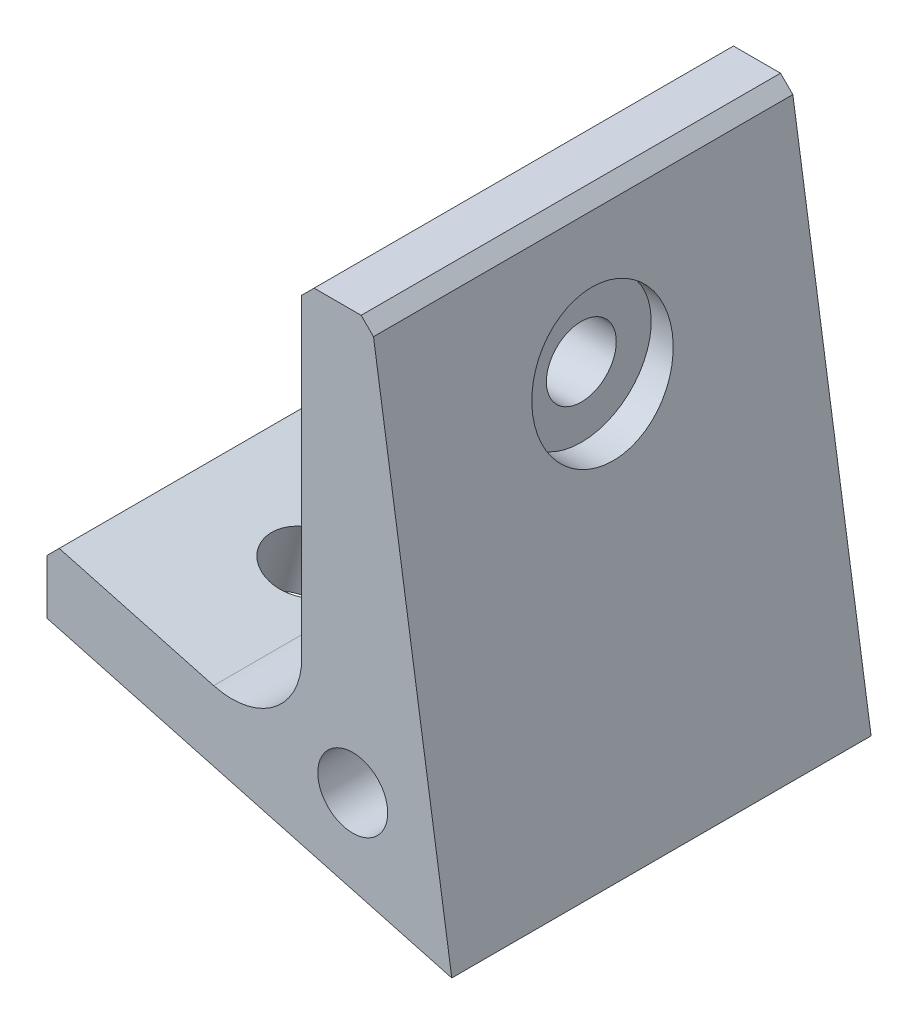
ISO-10303-21;
HEADER;
FILE_DESCRIPTION(('STEP AP214'),'2;1');
FILE_NAME('part.step','',(''),(''),'','','');
FILE_SCHEMA(('AUTOMOTIVE_DESIGN { 1 0 10303 214 1 1 1 1 }'));
ENDSEC;
DATA;
#1=APPLICATION_CONTEXT('core data for automotive mechanical design processes');
#2=APPLICATION_PROTOCOL_DEFINITION('international standard','automotive_design',2000,#1);
#3=PRODUCT_CONTEXT('',#1,'mechanical');
#4=PRODUCT('Part','Part','',(#3));
#5=PRODUCT_RELATED_PRODUCT_CATEGORY('part','',(#4));
#6=PRODUCT_DEFINITION_FORMATION('','',#4);
#7=PRODUCT_DEFINITION_CONTEXT('part definition',#1,'design');
#8=PRODUCT_DEFINITION('design','',#6,#7);
#9=PRODUCT_DEFINITION_SHAPE('','',#8);
#10=(LENGTH_UNIT() NAMED_UNIT(*) SI_UNIT(.MILLI.,.METRE.));
#11=(NAMED_UNIT(*) PLANE_ANGLE_UNIT() SI_UNIT($,.RADIAN.));
#12=(NAMED_UNIT(*) SI_UNIT($,.STERADIAN.) SOLID_ANGLE_UNIT());
#13=UNCERTAINTY_MEASURE_WITH_UNIT(LENGTH_MEASURE(1.E-05),#10,'distance_accuracy_value','');
#14=(GEOMETRIC_REPRESENTATION_CONTEXT(3) GLOBAL_UNCERTAINTY_ASSIGNED_CONTEXT((#13)) GLOBAL_UNIT_ASSIGNED_CONTEXT((#10,
#11,#12)) REPRESENTATION_CONTEXT('',''));
#15=CARTESIAN_POINT('',(0.,0.,0.));
#16=DIRECTION('',(0.,0.,1.));
#17=DIRECTION('',(1.,0.,0.));
#18=AXIS2_PLACEMENT_3D('',#15,#16,#17);
#19=CARTESIAN_POINT('',(-1.5875,13.3554299740334,19.05));
#20=DIRECTION('',(0.,0.,1.));
#21=DIRECTION('',(1.,0.,0.));
#22=AXIS2_PLACEMENT_3D('',#19,#20,#21);
#23=PLANE('',#22);
#24=DIRECTION('',(0.965472630879224,-0.260504508642652,0.));
#25=VECTOR('',#24,1.);
#26=CARTESIAN_POINT('',(-18.3922536182492,4.96261088964253,19.05));
#27=LINE('',#26,#25);
#28=CARTESIAN_POINT('',(-18.3922536182492,4.96261088964253,19.05));
#29=VERTEX_POINT('',#28);
#30=CARTESIAN_POINT('',(18.3922536182492,-4.96261088964253,19.05));
#31=VERTEX_POINT('',#30);
#32=EDGE_CURVE('E164',#29,#31,#27,.T.);
#33=ORIENTED_EDGE('',*,*,#32,.T.);
#34=DIRECTION('',(-0.149869877657565,0.988705729613674,0.));
#35=VECTOR('',#34,1.);
#36=CARTESIAN_POINT('',(11.2826555182051,41.9400788745089,19.05));
#37=LINE('',#36,#35);
#38=CARTESIAN_POINT('',(11.2826555182051,41.9400788745089,19.05));
#39=VERTEX_POINT('',#38);
#40=EDGE_CURVE('E102',#31,#39,#37,.T.);
#41=ORIENTED_EDGE('',*,*,#40,.T.);
#42=DIRECTION('',(-0.707106781186547,0.707106781186548,0.));
#43=VECTOR('',#42,1.);
#44=CARTESIAN_POINT('',(10.1601235030715,43.0626108896425,19.05));
#45=LINE('',#44,#43);
#46=CARTESIAN_POINT('',(10.1601235030715,43.0626108896425,19.05));
#47=VERTEX_POINT('',#46);
#48=EDGE_CURVE('E214',#39,#47,#45,.T.);
#49=ORIENTED_EDGE('',*,*,#48,.T.);
#50=DIRECTION('',(-1.,0.,0.));
#51=VECTOR('',#50,1.);
#52=CARTESIAN_POINT('',(5.88503201513365,43.0626108896425,19.05));
#53=LINE('',#52,#51);
#54=CARTESIAN_POINT('',(5.88503201513365,43.0626108896425,19.05));
#55=VERTEX_POINT('',#54);
#56=EDGE_CURVE('E216',#47,#55,#53,.T.);
#57=ORIENTED_EDGE('',*,*,#56,.T.);
#58=DIRECTION('',(-0.707106781186552,-0.707106781186543,0.));
#59=VECTOR('',#58,1.);
#60=CARTESIAN_POINT('',(4.7625,41.9400788745089,19.05));
#61=LINE('',#60,#59);
#62=CARTESIAN_POINT('',(4.7625,41.9400788745089,19.05));
#63=VERTEX_POINT('',#62);
#64=EDGE_CURVE('E218',#55,#63,#61,.T.);
#65=ORIENTED_EDGE('',*,*,#64,.T.);
#66=DIRECTION('',(0.,-1.,0.));
#67=VECTOR('',#66,1.);
#68=CARTESIAN_POINT('',(4.7625,13.3554299740334,19.05));
#69=LINE('',#68,#67);
#70=CARTESIAN_POINT('',(4.7625,13.3554299740334,19.05));
#71=VERTEX_POINT('',#70);
#72=EDGE_CURVE('E220',#63,#71,#69,.T.);
#73=ORIENTED_EDGE('',*,*,#72,.T.);
#74=CARTESIAN_POINT('',(-1.5875,13.3554299740334,19.05));
#75=DIRECTION('',(0.,0.,-1.));
#76=DIRECTION('',(1.,0.,0.));
#77=AXIS2_PLACEMENT_3D('',#74,#75,#76);
#78=CIRCLE('',#77,6.35);
#79=CARTESIAN_POINT('',(-3.24170362988084,7.22467876795034,19.05));
#80=VERTEX_POINT('',#79);
#81=EDGE_CURVE('E127',#71,#80,#78,.T.);
#82=ORIENTED_EDGE('',*,*,#81,.T.);
#83=DIRECTION('',(-0.965472630879224,0.260504508642652,0.));
#84=VECTOR('',#83,1.);
#85=CARTESIAN_POINT('',(-17.2697216031156,11.0097285067709,19.05));
#86=LINE('',#85,#84);
#87=CARTESIAN_POINT('',(-17.2697216031156,11.0097285067709,19.05));
#88=VERTEX_POINT('',#87);
#89=EDGE_CURVE('E121',#80,#88,#86,.T.);
#90=ORIENTED_EDGE('',*,*,#89,.T.);
#91=DIRECTION('',(-0.707106781186547,-0.707106781186547,0.));
#92=VECTOR('',#91,1.);
#93=CARTESIAN_POINT('',(-18.3922536182492,9.88719649163726,19.05));
#94=LINE('',#93,#92);
#95=CARTESIAN_POINT('',(-18.3922536182492,9.88719649163726,19.05));
#96=VERTEX_POINT('',#95);
#97=EDGE_CURVE('E125',#88,#96,#94,.T.);
#98=ORIENTED_EDGE('',*,*,#97,.T.);
#99=DIRECTION('',(0.,-1.,0.));
#100=VECTOR('',#99,1.);
#101=CARTESIAN_POINT('',(-18.3922536182492,4.96261088964253,19.05));
#102=LINE('',#101,#100);
#103=EDGE_CURVE('E53',#96,#29,#102,.T.);
#104=ORIENTED_EDGE('',*,*,#103,.T.);
#105=EDGE_LOOP('',(#33,#41,#49,#57,#65,#73,#82,#90,#98,#104));
#106=FACE_BOUND('',#105,.T.);
#107=CARTESIAN_POINT('',(9.39710867221507,5.11216620813619,19.05));
#108=DIRECTION('',(0.,0.,1.));
#109=DIRECTION('',(1.,0.,0.));
#110=AXIS2_PLACEMENT_3D('',#107,#108,#109);
#111=CIRCLE('',#110,3.175);
#112=CARTESIAN_POINT('',(6.22210867221506,5.11216620813619,19.05));
#113=VERTEX_POINT('',#112);
#114=EDGE_CURVE('E149',#113,#113,#111,.T.);
#115=ORIENTED_EDGE('',*,*,#114,.F.);
#116=EDGE_LOOP('',(#115));
#117=FACE_BOUND('',#116,.T.);
#118=ADVANCED_FACE('F34',(#106,#117),#23,.T.);
#119=CARTESIAN_POINT('',(-1.5875,13.3554299740334,-19.05));
#120=DIRECTION('',(0.,0.,1.));
#121=DIRECTION('',(1.,0.,0.));
#122=AXIS2_PLACEMENT_3D('',#119,#120,#121);
#123=PLANE('',#122);
#124=DIRECTION('',(0.965472630879224,-0.260504508642652,0.));
#125=VECTOR('',#124,1.);
#126=CARTESIAN_POINT('',(-18.3922536182492,4.96261088964253,-19.05));
#127=LINE('',#126,#125);
#128=CARTESIAN_POINT('',(-18.3922536182492,4.96261088964253,-19.05));
#129=VERTEX_POINT('',#128);
#130=CARTESIAN_POINT('',(18.3922536182492,-4.96261088964253,-19.05));
#131=VERTEX_POINT('',#130);
#132=EDGE_CURVE('E145',#129,#131,#127,.T.);
#133=ORIENTED_EDGE('',*,*,#132,.F.);
#134=DIRECTION('',(0.,-1.,0.));
#135=VECTOR('',#134,1.);
#136=CARTESIAN_POINT('',(-18.3922536182492,4.96261088964253,-19.05));
#137=LINE('',#136,#135);
#138=CARTESIAN_POINT('',(-18.3922536182492,9.88719649163726,-19.05));
#139=VERTEX_POINT('',#138);
#140=EDGE_CURVE('E94',#139,#129,#137,.T.);
#141=ORIENTED_EDGE('',*,*,#140,.F.);
#142=DIRECTION('',(-0.707106781186547,-0.707106781186547,0.));
#143=VECTOR('',#142,1.);
#144=CARTESIAN_POINT('',(-18.3922536182492,9.88719649163726,-19.05));
#145=LINE('',#144,#143);
#146=CARTESIAN_POINT('',(-17.2697216031156,11.0097285067709,-19.05));
#147=VERTEX_POINT('',#146);
#148=EDGE_CURVE('E88',#147,#139,#145,.T.);
#149=ORIENTED_EDGE('',*,*,#148,.F.);
#150=DIRECTION('',(-0.965472630879224,0.260504508642652,0.));
#151=VECTOR('',#150,1.);
#152=CARTESIAN_POINT('',(-17.2697216031156,11.0097285067709,-19.05));
#153=LINE('',#152,#151);
#154=CARTESIAN_POINT('',(-3.24170362988084,7.22467876795034,-19.05));
#155=VERTEX_POINT('',#154);
#156=EDGE_CURVE('E135',#155,#147,#153,.T.);
#157=ORIENTED_EDGE('',*,*,#156,.F.);
#158=CARTESIAN_POINT('',(-1.5875,13.3554299740334,-19.05));
#159=DIRECTION('',(0.,0.,-1.));
#160=DIRECTION('',(1.,0.,0.));
#161=AXIS2_PLACEMENT_3D('',#158,#159,#160);
#162=CIRCLE('',#161,6.35);
#163=CARTESIAN_POINT('',(4.7625,13.3554299740334,-19.05));
#164=VERTEX_POINT('',#163);
#165=EDGE_CURVE('E159',#164,#155,#162,.T.);
#166=ORIENTED_EDGE('',*,*,#165,.F.);
#167=DIRECTION('',(0.,-1.,0.));
#168=VECTOR('',#167,1.);
#169=CARTESIAN_POINT('',(4.7625,13.3554299740334,-19.05));
#170=LINE('',#169,#168);
#171=CARTESIAN_POINT('',(4.7625,41.9400788745089,-19.05));
#172=VERTEX_POINT('',#171);
#173=EDGE_CURVE('E157',#172,#164,#170,.T.);
#174=ORIENTED_EDGE('',*,*,#173,.F.);
#175=DIRECTION('',(-0.707106781186552,-0.707106781186543,0.));
#176=VECTOR('',#175,1.);
#177=CARTESIAN_POINT('',(4.7625,41.9400788745089,-19.05));
#178=LINE('',#177,#176);
#179=CARTESIAN_POINT('',(5.88503201513365,43.0626108896425,-19.05));
#180=VERTEX_POINT('',#179);
#181=EDGE_CURVE('E155',#180,#172,#178,.T.);
#182=ORIENTED_EDGE('',*,*,#181,.F.);
#183=DIRECTION('',(-1.,0.,0.));
#184=VECTOR('',#183,1.);
#185=CARTESIAN_POINT('',(5.88503201513365,43.0626108896425,-19.05));
#186=LINE('',#185,#184);
#187=CARTESIAN_POINT('',(10.1601235030715,43.0626108896425,-19.05));
#188=VERTEX_POINT('',#187);
#189=EDGE_CURVE('E153',#188,#180,#186,.T.);
#190=ORIENTED_EDGE('',*,*,#189,.F.);
#191=DIRECTION('',(-0.707106781186547,0.707106781186548,0.));
#192=VECTOR('',#191,1.);
#193=CARTESIAN_POINT('',(10.1601235030715,43.0626108896425,-19.05));
#194=LINE('',#193,#192);
#195=CARTESIAN_POINT('',(11.2826555182051,41.9400788745089,-19.05));
#196=VERTEX_POINT('',#195);
#197=EDGE_CURVE('E151',#196,#188,#194,.T.);
#198=ORIENTED_EDGE('',*,*,#197,.F.);
#199=DIRECTION('',(-0.149869877657565,0.988705729613674,0.));
#200=VECTOR('',#199,1.);
#201=CARTESIAN_POINT('',(11.2826555182051,41.9400788745089,-19.05));
#202=LINE('',#201,#200);
#203=EDGE_CURVE('E148',#131,#196,#202,.T.);
#204=ORIENTED_EDGE('',*,*,#203,.F.);
#205=EDGE_LOOP('',(#133,#141,#149,#157,#166,#174,#182,#190,#198,#204));
#206=FACE_BOUND('',#205,.T.);
#207=CARTESIAN_POINT('',(9.39710867221507,5.11216620813619,-19.05));
#208=DIRECTION('',(0.,0.,1.));
#209=DIRECTION('',(1.,0.,0.));
#210=AXIS2_PLACEMENT_3D('',#207,#208,#209);
#211=CIRCLE('',#210,3.175);
#212=CARTESIAN_POINT('',(6.22210867221506,5.11216620813619,-19.05));
#213=VERTEX_POINT('',#212);
#214=EDGE_CURVE('E185',#213,#213,#211,.T.);
#215=ORIENTED_EDGE('',*,*,#214,.T.);
#216=EDGE_LOOP('',(#215));
#217=FACE_BOUND('',#216,.T.);
#218=ADVANCED_FACE('F233',(#206,#217),#123,.F.);
#219=CARTESIAN_POINT('',(-18.3922536182492,4.96261088964253,19.05));
#220=DIRECTION('',(0.260504508642652,0.965472630879224,0.));
#221=DIRECTION('',(-0.965472630879224,0.260504508642652,0.));
#222=AXIS2_PLACEMENT_3D('',#219,#220,#221);
#223=PLANE('',#222);
#224=CARTESIAN_POINT('',(-9.19612680912461,2.48130544482126,6.35));
#225=DIRECTION('',(-0.260504508642652,-0.965472630879224,0.));
#226=DIRECTION('',(0.965472630879224,-0.260504508642652,0.));
#227=AXIS2_PLACEMENT_3D('',#224,#225,#226);
#228=CIRCLE('',#227,3.17499999999999);
#229=CARTESIAN_POINT('',(-6.13075120608308,1.65420362988084,6.35));
#230=VERTEX_POINT('',#229);
#231=EDGE_CURVE('E195',#230,#230,#228,.T.);
#232=ORIENTED_EDGE('',*,*,#231,.F.);
#233=EDGE_LOOP('',(#232));
#234=FACE_BOUND('',#233,.T.);
#235=CARTESIAN_POINT('',(-9.19612680912461,2.48130544482126,-6.35));
#236=DIRECTION('',(-0.260504508642652,-0.965472630879224,0.));
#237=DIRECTION('',(0.965472630879224,-0.260504508642652,0.));
#238=AXIS2_PLACEMENT_3D('',#235,#236,#237);
#239=CIRCLE('',#238,3.17499999999999);
#240=CARTESIAN_POINT('',(-6.13075120608308,1.65420362988084,-6.35));
#241=VERTEX_POINT('',#240);
#242=EDGE_CURVE('E188',#241,#241,#239,.T.);
#243=ORIENTED_EDGE('',*,*,#242,.F.);
#244=EDGE_LOOP('',(#243));
#245=FACE_BOUND('',#244,.T.);
#246=ORIENTED_EDGE('',*,*,#132,.T.);
#247=DIRECTION('',(0.,0.,-1.));
#248=VECTOR('',#247,1.);
#249=CARTESIAN_POINT('',(18.3922536182492,-4.96261088964253,19.05));
#250=LINE('',#249,#248);
#251=EDGE_CURVE('E12',#31,#131,#250,.T.);
#252=ORIENTED_EDGE('',*,*,#251,.F.);
#253=ORIENTED_EDGE('',*,*,#32,.F.);
#254=DIRECTION('',(0.,0.,-1.));
#255=VECTOR('',#254,1.);
#256=CARTESIAN_POINT('',(-18.3922536182492,4.96261088964253,19.05));
#257=LINE('',#256,#255);
#258=EDGE_CURVE('E141',#29,#129,#257,.T.);
#259=ORIENTED_EDGE('',*,*,#258,.T.);
#260=EDGE_LOOP('',(#246,#252,#253,#259));
#261=FACE_BOUND('',#260,.T.);
#262=ADVANCED_FACE('F36',(#234,#245,#261),#223,.F.);
#263=CARTESIAN_POINT('',(11.2826555182051,41.9400788745089,19.05));
#264=DIRECTION('',(-0.988705729613674,-0.149869877657565,0.));
#265=DIRECTION('',(0.149869877657565,-0.988705729613674,0.));
#266=AXIS2_PLACEMENT_3D('',#263,#264,#265);
#267=PLANE('',#266);
#268=CARTESIAN_POINT('',(13.0375899324663,30.3626108896425,0.));
#269=DIRECTION('',(-0.988705729613674,-0.149869877657565,0.));
#270=DIRECTION('',(-0.149869877657565,0.988705729613674,0.));
#271=AXIS2_PLACEMENT_3D('',#268,#269,#270);
#272=ELLIPSE('',#271,6.4225378793761,6.35);
#273=CARTESIAN_POINT('',(12.0750449662332,36.7126108896425,0.));
#274=VERTEX_POINT('',#273);
#275=EDGE_CURVE('E38',#274,#274,#272,.T.);
#276=ORIENTED_EDGE('',*,*,#275,.T.);
#277=EDGE_LOOP('',(#276));
#278=FACE_BOUND('',#277,.T.);
#279=ORIENTED_EDGE('',*,*,#203,.T.);
#280=DIRECTION('',(0.,0.,-1.));
#281=VECTOR('',#280,1.);
#282=CARTESIAN_POINT('',(11.2826555182051,41.9400788745089,19.05));
#283=LINE('',#282,#281);
#284=EDGE_CURVE('E44',#39,#196,#283,.T.);
#285=ORIENTED_EDGE('',*,*,#284,.F.);
#286=ORIENTED_EDGE('',*,*,#40,.F.);
#287=ORIENTED_EDGE('',*,*,#251,.T.);
#288=EDGE_LOOP('',(#279,#285,#286,#287));
#289=FACE_BOUND('',#288,.T.);
#290=ADVANCED_FACE('F324',(#278,#289),#267,.F.);
#291=CARTESIAN_POINT('',(10.1601235030715,43.0626108896425,19.05));
#292=DIRECTION('',(-0.707106781186548,-0.707106781186547,0.));
#293=DIRECTION('',(0.707106781186547,-0.707106781186548,0.));
#294=AXIS2_PLACEMENT_3D('',#291,#292,#293);
#295=PLANE('',#294);
#296=ORIENTED_EDGE('',*,*,#197,.T.);
#297=DIRECTION('',(0.,0.,-1.));
#298=VECTOR('',#297,1.);
#299=CARTESIAN_POINT('',(10.1601235030715,43.0626108896425,19.05));
#300=LINE('',#299,#298);
#301=EDGE_CURVE('E177',#47,#188,#300,.T.);
#302=ORIENTED_EDGE('',*,*,#301,.F.);
#303=ORIENTED_EDGE('',*,*,#48,.F.);
#304=ORIENTED_EDGE('',*,*,#284,.T.);
#305=EDGE_LOOP('',(#296,#302,#303,#304));
#306=FACE_BOUND('',#305,.T.);
#307=ADVANCED_FACE('F364',(#306),#295,.F.);
#308=CARTESIAN_POINT('',(5.88503201513365,43.0626108896425,19.05));
#309=DIRECTION('',(0.,-1.,0.));
#310=DIRECTION('',(0.,0.,-1.));
#311=AXIS2_PLACEMENT_3D('',#308,#309,#310);
#312=PLANE('',#311);
#313=ORIENTED_EDGE('',*,*,#189,.T.);
#314=DIRECTION('',(0.,0.,-1.));
#315=VECTOR('',#314,1.);
#316=CARTESIAN_POINT('',(5.88503201513365,43.0626108896425,19.05));
#317=LINE('',#316,#315);
#318=EDGE_CURVE('E174',#55,#180,#317,.T.);
#319=ORIENTED_EDGE('',*,*,#318,.F.);
#320=ORIENTED_EDGE('',*,*,#56,.F.);
#321=ORIENTED_EDGE('',*,*,#301,.T.);
#322=EDGE_LOOP('',(#313,#319,#320,#321));
#323=FACE_BOUND('',#322,.T.);
#324=ADVANCED_FACE('F354',(#323),#312,.F.);
#325=CARTESIAN_POINT('',(4.7625,41.9400788745089,19.05));
#326=DIRECTION('',(0.707106781186543,-0.707106781186552,0.));
#327=DIRECTION('',(0.707106781186552,0.707106781186543,0.));
#328=AXIS2_PLACEMENT_3D('',#325,#326,#327);
#329=PLANE('',#328);
#330=ORIENTED_EDGE('',*,*,#181,.T.);
#331=DIRECTION('',(0.,0.,-1.));
#332=VECTOR('',#331,1.);
#333=CARTESIAN_POINT('',(4.7625,41.9400788745089,19.05));
#334=LINE('',#333,#332);
#335=EDGE_CURVE('E171',#63,#172,#334,.T.);
#336=ORIENTED_EDGE('',*,*,#335,.F.);
#337=ORIENTED_EDGE('',*,*,#64,.F.);
#338=ORIENTED_EDGE('',*,*,#318,.T.);
#339=EDGE_LOOP('',(#330,#336,#337,#338));
#340=FACE_BOUND('',#339,.T.);
#341=ADVANCED_FACE('F311',(#340),#329,.F.);
#342=CARTESIAN_POINT('',(4.7625,13.3554299740334,19.05));
#343=DIRECTION('',(1.,0.,0.));
#344=DIRECTION('',(0.,1.,0.));
#345=AXIS2_PLACEMENT_3D('',#342,#343,#344);
#346=PLANE('',#345);
#347=CARTESIAN_POINT('',(4.7625,30.3626108896425,0.));
#348=DIRECTION('',(1.,0.,0.));
#349=DIRECTION('',(0.,1.,0.));
#350=AXIS2_PLACEMENT_3D('',#347,#348,#349);
#351=CIRCLE('',#350,3.175);
#352=CARTESIAN_POINT('',(4.7625,33.5376108896425,0.));
#353=VERTEX_POINT('',#352);
#354=EDGE_CURVE('E182',#353,#353,#351,.T.);
#355=ORIENTED_EDGE('',*,*,#354,.T.);
#356=EDGE_LOOP('',(#355));
#357=FACE_BOUND('',#356,.T.);
#358=ORIENTED_EDGE('',*,*,#173,.T.);
#359=DIRECTION('',(0.,0.,-1.));
#360=VECTOR('',#359,1.);
#361=CARTESIAN_POINT('',(4.7625,13.3554299740334,19.05));
#362=LINE('',#361,#360);
#363=EDGE_CURVE('E168',#71,#164,#362,.T.);
#364=ORIENTED_EDGE('',*,*,#363,.F.);
#365=ORIENTED_EDGE('',*,*,#72,.F.);
#366=ORIENTED_EDGE('',*,*,#335,.T.);
#367=EDGE_LOOP('',(#358,#364,#365,#366));
#368=FACE_BOUND('',#367,.T.);
#369=ADVANCED_FACE('F226',(#357,#368),#346,.F.);
#370=CARTESIAN_POINT('',(-1.5875,13.3554299740334,19.05));
#371=DIRECTION('',(0.,0.,-1.));
#372=DIRECTION('',(-1.,0.,0.));
#373=AXIS2_PLACEMENT_3D('',#370,#371,#372);
#374=CYLINDRICAL_SURFACE('',#373,6.35);
#375=ORIENTED_EDGE('',*,*,#165,.T.);
#376=DIRECTION('',(0.,0.,-1.));
#377=VECTOR('',#376,1.);
#378=CARTESIAN_POINT('',(-3.24170362988084,7.22467876795034,19.05));
#379=LINE('',#378,#377);
#380=EDGE_CURVE('E136',#80,#155,#379,.T.);
#381=ORIENTED_EDGE('',*,*,#380,.F.);
#382=ORIENTED_EDGE('',*,*,#81,.F.);
#383=ORIENTED_EDGE('',*,*,#363,.T.);
#384=EDGE_LOOP('',(#375,#381,#382,#383));
#385=FACE_BOUND('',#384,.T.);
#386=ADVANCED_FACE('F230',(#385),#374,.F.);
#387=CARTESIAN_POINT('',(-17.2697216031156,11.0097285067709,19.05));
#388=DIRECTION('',(-0.260504508642652,-0.965472630879224,0.));
#389=DIRECTION('',(0.965472630879224,-0.260504508642652,0.));
#390=AXIS2_PLACEMENT_3D('',#387,#388,#389);
#391=PLANE('',#390);
#392=CARTESIAN_POINT('',(-7.59903847857359,8.40037794102426,6.35));
#393=DIRECTION('',(-0.260504508642652,-0.965472630879224,0.));
#394=DIRECTION('',(0.965472630879224,-0.260504508642652,0.));
#395=AXIS2_PLACEMENT_3D('',#392,#393,#394);
#396=CIRCLE('',#395,3.17499999999999);
#397=CARTESIAN_POINT('',(-4.53366287553206,7.57327612608384,6.35));
#398=VERTEX_POINT('',#397);
#399=EDGE_CURVE('E203',#398,#398,#396,.T.);
#400=ORIENTED_EDGE('',*,*,#399,.T.);
#401=EDGE_LOOP('',(#400));
#402=FACE_BOUND('',#401,.T.);
#403=CARTESIAN_POINT('',(-7.59903847857359,8.40037794102426,-6.35));
#404=DIRECTION('',(-0.260504508642652,-0.965472630879224,0.));
#405=DIRECTION('',(0.965472630879224,-0.260504508642652,0.));
#406=AXIS2_PLACEMENT_3D('',#403,#404,#405);
#407=CIRCLE('',#406,3.17499999999999);
#408=CARTESIAN_POINT('',(-4.53366287553206,7.57327612608384,-6.35));
#409=VERTEX_POINT('',#408);
#410=EDGE_CURVE('E186',#409,#409,#407,.T.);
#411=ORIENTED_EDGE('',*,*,#410,.T.);
#412=EDGE_LOOP('',(#411));
#413=FACE_BOUND('',#412,.T.);
#414=ORIENTED_EDGE('',*,*,#156,.T.);
#415=DIRECTION('',(0.,0.,-1.));
#416=VECTOR('',#415,1.);
#417=CARTESIAN_POINT('',(-17.2697216031156,11.0097285067709,19.05));
#418=LINE('',#417,#416);
#419=EDGE_CURVE('E132',#88,#147,#418,.T.);
#420=ORIENTED_EDGE('',*,*,#419,.F.);
#421=ORIENTED_EDGE('',*,*,#89,.F.);
#422=ORIENTED_EDGE('',*,*,#380,.T.);
#423=EDGE_LOOP('',(#414,#420,#421,#422));
#424=FACE_BOUND('',#423,.T.);
#425=ADVANCED_FACE('F133',(#402,#413,#424),#391,.F.);
#426=CARTESIAN_POINT('',(-18.3922536182492,9.88719649163726,19.05));
#427=DIRECTION('',(0.707106781186547,-0.707106781186547,0.));
#428=DIRECTION('',(0.707106781186548,0.707106781186548,0.));
#429=AXIS2_PLACEMENT_3D('',#426,#427,#428);
#430=PLANE('',#429);
#431=ORIENTED_EDGE('',*,*,#148,.T.);
#432=DIRECTION('',(0.,0.,-1.));
#433=VECTOR('',#432,1.);
#434=CARTESIAN_POINT('',(-18.3922536182492,9.88719649163726,19.05));
#435=LINE('',#434,#433);
#436=EDGE_CURVE('E137',#96,#139,#435,.T.);
#437=ORIENTED_EDGE('',*,*,#436,.F.);
#438=ORIENTED_EDGE('',*,*,#97,.F.);
#439=ORIENTED_EDGE('',*,*,#419,.T.);
#440=EDGE_LOOP('',(#431,#437,#438,#439));
#441=FACE_BOUND('',#440,.T.);
#442=ADVANCED_FACE('F139',(#441),#430,.F.);
#443=CARTESIAN_POINT('',(-18.3922536182492,4.96261088964253,19.05));
#444=DIRECTION('',(1.,0.,0.));
#445=DIRECTION('',(0.,0.,-1.));
#446=AXIS2_PLACEMENT_3D('',#443,#444,#445);
#447=PLANE('',#446);
#448=ORIENTED_EDGE('',*,*,#140,.T.);
#449=ORIENTED_EDGE('',*,*,#258,.F.);
#450=ORIENTED_EDGE('',*,*,#103,.F.);
#451=ORIENTED_EDGE('',*,*,#436,.T.);
#452=EDGE_LOOP('',(#448,#449,#450,#451));
#453=FACE_BOUND('',#452,.T.);
#454=ADVANCED_FACE('F239',(#453),#447,.F.);
#455=CARTESIAN_POINT('',(9.39710867221507,5.11216620813619,19.05));
#456=DIRECTION('',(0.,0.,-1.));
#457=DIRECTION('',(-1.,0.,0.));
#458=AXIS2_PLACEMENT_3D('',#455,#456,#457);
#459=CYLINDRICAL_SURFACE('',#458,3.175);
#460=CARTESIAN_POINT('',(6.22210867221506,5.11216620813619,19.05));
#461=CARTESIAN_POINT('',(6.22210867221506,5.11216620813619,18.653125));
#462=CARTESIAN_POINT('',(6.22210867221506,5.11216620813619,18.25625));
#463=CARTESIAN_POINT('',(6.22210867221506,5.11216620813619,17.4625));
#464=CARTESIAN_POINT('',(6.22210867221506,5.11216620813619,17.065625));
#465=CARTESIAN_POINT('',(6.22210867221506,5.11216620813619,16.271875));
#466=CARTESIAN_POINT('',(6.22210867221506,5.11216620813619,15.875));
#467=CARTESIAN_POINT('',(6.22210867221506,5.11216620813619,15.08125));
#468=CARTESIAN_POINT('',(6.22210867221506,5.11216620813619,14.684375));
#469=CARTESIAN_POINT('',(6.22210867221506,5.11216620813619,13.890625));
#470=CARTESIAN_POINT('',(6.22210867221506,5.11216620813619,13.49375));
#471=CARTESIAN_POINT('',(6.22210867221506,5.11216620813619,12.7));
#472=CARTESIAN_POINT('',(6.22210867221506,5.11216620813619,12.303125));
#473=CARTESIAN_POINT('',(6.22210867221506,5.11216620813619,11.509375));
#474=CARTESIAN_POINT('',(6.22210867221506,5.11216620813619,11.1125));
#475=CARTESIAN_POINT('',(6.22210867221506,5.11216620813619,10.31875));
#476=CARTESIAN_POINT('',(6.22210867221506,5.11216620813619,9.921875));
#477=CARTESIAN_POINT('',(6.22210867221506,5.11216620813619,9.128125));
#478=CARTESIAN_POINT('',(6.22210867221506,5.11216620813619,8.73125));
#479=CARTESIAN_POINT('',(6.22210867221506,5.11216620813619,7.9375));
#480=CARTESIAN_POINT('',(6.22210867221506,5.11216620813619,7.540625));
#481=CARTESIAN_POINT('',(6.22210867221506,5.11216620813619,6.746875));
#482=CARTESIAN_POINT('',(6.22210867221506,5.11216620813619,6.35));
#483=CARTESIAN_POINT('',(6.22210867221506,5.11216620813619,5.55625));
#484=CARTESIAN_POINT('',(6.22210867221506,5.11216620813619,5.159375));
#485=CARTESIAN_POINT('',(6.22210867221506,5.11216620813619,4.365625));
#486=CARTESIAN_POINT('',(6.22210867221506,5.11216620813619,3.96875));
#487=CARTESIAN_POINT('',(6.22210867221506,5.11216620813619,3.175));
#488=CARTESIAN_POINT('',(6.22210867221506,5.11216620813619,2.778125));
#489=CARTESIAN_POINT('',(6.22210867221506,5.11216620813619,1.984375));
#490=CARTESIAN_POINT('',(6.22210867221506,5.11216620813619,1.5875));
#491=CARTESIAN_POINT('',(6.22210867221506,5.11216620813619,0.79375));
#492=CARTESIAN_POINT('',(6.22210867221506,5.11216620813619,0.396875));
#493=CARTESIAN_POINT('',(6.22210867221506,5.11216620813619,-0.396875));
#494=CARTESIAN_POINT('',(6.22210867221506,5.11216620813619,-0.79375));
#495=CARTESIAN_POINT('',(6.22210867221506,5.11216620813619,-1.5875));
#496=CARTESIAN_POINT('',(6.22210867221506,5.11216620813619,-1.984375));
#497=CARTESIAN_POINT('',(6.22210867221506,5.11216620813619,-2.778125));
#498=CARTESIAN_POINT('',(6.22210867221506,5.11216620813619,-3.175));
#499=CARTESIAN_POINT('',(6.22210867221506,5.11216620813619,-3.96875));
#500=CARTESIAN_POINT('',(6.22210867221506,5.11216620813619,-4.365625));
#501=CARTESIAN_POINT('',(6.22210867221506,5.11216620813619,-5.159375));
#502=CARTESIAN_POINT('',(6.22210867221506,5.11216620813619,-5.55625));
#503=CARTESIAN_POINT('',(6.22210867221506,5.11216620813619,-6.35));
#504=CARTESIAN_POINT('',(6.22210867221506,5.11216620813619,-6.746875));
#505=CARTESIAN_POINT('',(6.22210867221506,5.11216620813619,-7.540625));
#506=CARTESIAN_POINT('',(6.22210867221506,5.11216620813619,-7.9375));
#507=CARTESIAN_POINT('',(6.22210867221506,5.11216620813619,-8.73125));
#508=CARTESIAN_POINT('',(6.22210867221506,5.11216620813619,-9.128125));
#509=CARTESIAN_POINT('',(6.22210867221506,5.11216620813619,-9.921875));
#510=CARTESIAN_POINT('',(6.22210867221506,5.11216620813619,-10.31875));
#511=CARTESIAN_POINT('',(6.22210867221506,5.11216620813619,-11.1125));
#512=CARTESIAN_POINT('',(6.22210867221506,5.11216620813619,-11.509375));
#513=CARTESIAN_POINT('',(6.22210867221506,5.11216620813619,-12.303125));
#514=CARTESIAN_POINT('',(6.22210867221506,5.11216620813619,-12.7));
#515=CARTESIAN_POINT('',(6.22210867221506,5.11216620813619,-13.49375));
#516=CARTESIAN_POINT('',(6.22210867221506,5.11216620813619,-13.890625));
#517=CARTESIAN_POINT('',(6.22210867221506,5.11216620813619,-14.684375));
#518=CARTESIAN_POINT('',(6.22210867221506,5.11216620813619,-15.08125));
#519=CARTESIAN_POINT('',(6.22210867221506,5.11216620813619,-15.875));
#520=CARTESIAN_POINT('',(6.22210867221506,5.11216620813619,-16.271875));
#521=CARTESIAN_POINT('',(6.22210867221506,5.11216620813619,-17.065625));
#522=CARTESIAN_POINT('',(6.22210867221506,5.11216620813619,-17.4625));
#523=CARTESIAN_POINT('',(6.22210867221506,5.11216620813619,-18.25625));
#524=CARTESIAN_POINT('',(6.22210867221506,5.11216620813619,-18.653125));
#525=CARTESIAN_POINT('',(6.22210867221506,5.11216620813619,-19.05));
#526=B_SPLINE_CURVE_WITH_KNOTS('',3,(#460,#461,#462,#463,#464,#465,#466,#467,#468,#469,#470,
#471,#472,#473,#474,#475,#476,#477,#478,#479,#480,#481,#482,#483,#484,#485,#486,#487,#488,#489,
#490,#491,#492,#493,#494,#495,#496,#497,#498,#499,#500,#501,#502,#503,#504,#505,#506,#507,#508,
#509,#510,#511,#512,#513,#514,#515,#516,#517,#518,#519,#520,#521,#522,#523,#524,#525),
.UNSPECIFIED.,.F.,.F.,(4,2,2,2,2,2,2,2,2,2,2,2,2,2,2,2,2,2,2,2,2,2,2,2,2,2,2,2,2,2,2,2,4),(0.,
1.190625,2.38125,3.571875,4.7625,5.953125,7.14375,8.334375,9.525,10.715625,11.90625,13.096875,
14.2875,15.478125,16.66875,17.859375,19.05,20.240625,21.43125,22.621875,23.8125,25.003125,
26.19375,27.384375,28.575,29.765625,30.95625,32.146875,33.3375,34.528125,35.71875,36.909375,
38.1),.UNSPECIFIED.);
#527=EDGE_CURVE('BSEAM241',#113,#213,#526,.T.);
#528=ORIENTED_EDGE('',*,*,#114,.T.);
#529=ORIENTED_EDGE('',*,*,#214,.F.);
#530=ORIENTED_EDGE('',*,*,#527,.T.);
#531=ORIENTED_EDGE('',*,*,#527,.F.);
#532=EDGE_LOOP('',(#528,#530,#529,#531));
#533=FACE_BOUND('',#532,.T.);
#534=ADVANCED_FACE('F241',(#533),#459,.F.);
#535=CARTESIAN_POINT('',(-18.3922536182492,30.3626108896425,0.));
#536=DIRECTION('',(1.,0.,0.));
#537=DIRECTION('',(0.,1.,0.));
#538=AXIS2_PLACEMENT_3D('',#535,#536,#537);
#539=CYLINDRICAL_SURFACE('',#538,3.175);
#540=CARTESIAN_POINT('',(11.1125,30.3626108896425,0.));
#541=DIRECTION('',(-1.,0.,0.));
#542=DIRECTION('',(0.,-1.,0.));
#543=AXIS2_PLACEMENT_3D('',#540,#541,#542);
#544=CIRCLE('',#543,3.175);
#545=CARTESIAN_POINT('',(11.1125,27.1876108896425,0.));
#546=VERTEX_POINT('',#545);
#547=EDGE_CURVE('E189',#546,#546,#544,.F.);
#548=ORIENTED_EDGE('',*,*,#547,.T.);
#549=EDGE_LOOP('',(#548));
#550=FACE_BOUND('',#549,.T.);
#551=ORIENTED_EDGE('',*,*,#354,.F.);
#552=EDGE_LOOP('',(#551));
#553=FACE_BOUND('',#552,.T.);
#554=ADVANCED_FACE('F247',(#550,#553),#539,.F.);
#555=CARTESIAN_POINT('',(-9.19612680912461,2.48130544482126,-6.35));
#556=DIRECTION('',(-0.260504508642652,-0.965472630879224,0.));
#557=DIRECTION('',(0.965472630879224,-0.260504508642652,0.));
#558=AXIS2_PLACEMENT_3D('',#555,#556,#557);
#559=CYLINDRICAL_SURFACE('',#558,3.17499999999999);
#560=ORIENTED_EDGE('',*,*,#242,.T.);
#561=EDGE_LOOP('',(#560));
#562=FACE_BOUND('',#561,.T.);
#563=ORIENTED_EDGE('',*,*,#410,.F.);
#564=EDGE_LOOP('',(#563));
#565=FACE_BOUND('',#564,.T.);
#566=ADVANCED_FACE('F260',(#562,#565),#559,.F.);
#567=CARTESIAN_POINT('',(-9.19612680912461,2.48130544482126,6.35));
#568=DIRECTION('',(-0.260504508642652,-0.965472630879224,0.));
#569=DIRECTION('',(0.965472630879224,-0.260504508642652,0.));
#570=AXIS2_PLACEMENT_3D('',#567,#568,#569);
#571=CYLINDRICAL_SURFACE('',#570,3.17499999999999);
#572=ORIENTED_EDGE('',*,*,#231,.T.);
#573=EDGE_LOOP('',(#572));
#574=FACE_BOUND('',#573,.T.);
#575=ORIENTED_EDGE('',*,*,#399,.F.);
#576=EDGE_LOOP('',(#575));
#577=FACE_BOUND('',#576,.T.);
#578=ADVANCED_FACE('F263',(#574,#577),#571,.F.);
#579=CARTESIAN_POINT('',(18.3922536182492,30.3626108896425,0.));
#580=DIRECTION('',(-1.,0.,0.));
#581=DIRECTION('',(0.,-1.,0.));
#582=AXIS2_PLACEMENT_3D('',#579,#580,#581);
#583=CYLINDRICAL_SURFACE('',#582,6.35);
#584=CARTESIAN_POINT('',(11.1125,30.3626108896425,0.));
#585=DIRECTION('',(-1.,0.,0.));
#586=DIRECTION('',(0.,-1.,0.));
#587=AXIS2_PLACEMENT_3D('',#584,#585,#586);
#588=CIRCLE('',#587,6.35);
#589=CARTESIAN_POINT('',(11.1125,24.0126108896425,0.));
#590=VERTEX_POINT('',#589);
#591=EDGE_CURVE('E191',#590,#590,#588,.T.);
#592=ORIENTED_EDGE('',*,*,#591,.T.);
#593=EDGE_LOOP('',(#592));
#594=FACE_BOUND('',#593,.T.);
#595=ORIENTED_EDGE('',*,*,#275,.F.);
#596=EDGE_LOOP('',(#595));
#597=FACE_BOUND('',#596,.T.);
#598=ADVANCED_FACE('F267',(#594,#597),#583,.F.);
#599=CARTESIAN_POINT('',(11.1125,30.3626108896425,0.));
#600=DIRECTION('',(-1.,0.,0.));
#601=DIRECTION('',(0.,-1.,0.));
#602=AXIS2_PLACEMENT_3D('',#599,#600,#601);
#603=PLANE('',#602);
#604=ORIENTED_EDGE('',*,*,#591,.F.);
#605=EDGE_LOOP('',(#604));
#606=FACE_BOUND('',#605,.T.);
#607=ORIENTED_EDGE('',*,*,#547,.F.);
#608=EDGE_LOOP('',(#607));
#609=FACE_BOUND('',#608,.T.);
#610=ADVANCED_FACE('F271',(#606,#609),#603,.F.);
#611=CLOSED_SHELL('',(#118,#218,#262,#290,#307,#324,#341,#369,#386,#425,#442,#454,#534,#554,
#566,#578,#598,#610));
#612=MANIFOLD_SOLID_BREP('B2',#611);
#613=ADVANCED_BREP_SHAPE_REPRESENTATION('',(#18,#612),#14);
#614=SHAPE_DEFINITION_REPRESENTATION(#9,#613);
ENDSEC;
END-ISO-10303-21;
